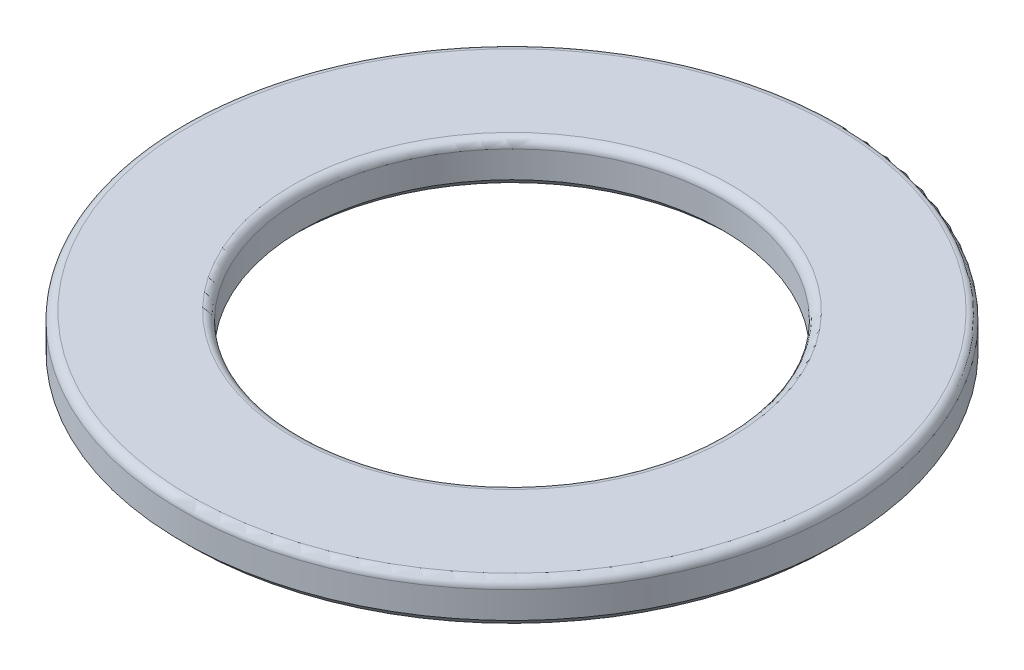
ISO-10303-21;
HEADER;
FILE_DESCRIPTION(('STEP AP214'),'2;1');
FILE_NAME('part.step','',(''),(''),'','','');
FILE_SCHEMA(('AUTOMOTIVE_DESIGN { 1 0 10303 214 1 1 1 1 }'));
ENDSEC;
DATA;
#1=APPLICATION_CONTEXT('core data for automotive mechanical design processes');
#2=APPLICATION_PROTOCOL_DEFINITION('international standard','automotive_design',2000,#1);
#3=PRODUCT_CONTEXT('',#1,'mechanical');
#4=PRODUCT('Part','Part','',(#3));
#5=PRODUCT_RELATED_PRODUCT_CATEGORY('part','',(#4));
#6=PRODUCT_DEFINITION_FORMATION('','',#4);
#7=PRODUCT_DEFINITION_CONTEXT('part definition',#1,'design');
#8=PRODUCT_DEFINITION('design','',#6,#7);
#9=PRODUCT_DEFINITION_SHAPE('','',#8);
#10=(LENGTH_UNIT() NAMED_UNIT(*) SI_UNIT(.MILLI.,.METRE.));
#11=(NAMED_UNIT(*) PLANE_ANGLE_UNIT() SI_UNIT($,.RADIAN.));
#12=(NAMED_UNIT(*) SI_UNIT($,.STERADIAN.) SOLID_ANGLE_UNIT());
#13=UNCERTAINTY_MEASURE_WITH_UNIT(LENGTH_MEASURE(1.E-05),#10,'distance_accuracy_value','');
#14=(GEOMETRIC_REPRESENTATION_CONTEXT(3) GLOBAL_UNCERTAINTY_ASSIGNED_CONTEXT((#13)) GLOBAL_UNIT_ASSIGNED_CONTEXT((#10,
#11,#12)) REPRESENTATION_CONTEXT('',''));
#15=CARTESIAN_POINT('',(0.,0.,0.));
#16=DIRECTION('',(0.,0.,1.));
#17=DIRECTION('',(1.,0.,0.));
#18=AXIS2_PLACEMENT_3D('',#15,#16,#17);
#19=CARTESIAN_POINT('',(19.25,11.,0.));
#20=DIRECTION('',(0.,1.,0.));
#21=DIRECTION('',(-1.,0.,0.));
#22=AXIS2_PLACEMENT_3D('',#19,#20,#21);
#23=PLANE('',#22);
#24=CARTESIAN_POINT('',(0.,11.,0.));
#25=DIRECTION('',(0.,-1.,0.));
#26=DIRECTION('',(1.,0.,0.));
#27=AXIS2_PLACEMENT_3D('',#24,#25,#26);
#28=CIRCLE('',#27,15.6);
#29=CARTESIAN_POINT('',(15.6,11.,0.));
#30=VERTEX_POINT('',#29);
#31=EDGE_CURVE('E11',#30,#30,#28,.T.);
#32=ORIENTED_EDGE('',*,*,#31,.T.);
#33=EDGE_LOOP('',(#32));
#34=FACE_BOUND('',#33,.T.);
#35=CARTESIAN_POINT('',(0.,11.,0.));
#36=DIRECTION('',(0.,-1.,0.));
#37=DIRECTION('',(1.,0.,0.));
#38=AXIS2_PLACEMENT_3D('',#35,#36,#37);
#39=CIRCLE('',#38,22.9);
#40=CARTESIAN_POINT('',(22.9,11.,0.));
#41=VERTEX_POINT('',#40);
#42=EDGE_CURVE('E65',#41,#41,#39,.T.);
#43=ORIENTED_EDGE('',*,*,#42,.F.);
#44=EDGE_LOOP('',(#43));
#45=FACE_BOUND('',#44,.T.);
#46=ADVANCED_FACE('F16',(#34,#45),#23,.T.);
#47=CARTESIAN_POINT('',(0.,10.4,0.));
#48=DIRECTION('',(0.,-1.,0.));
#49=DIRECTION('',(0.,0.,-1.));
#50=AXIS2_PLACEMENT_3D('',#47,#48,#49);
#51=TOROIDAL_SURFACE('',#50,15.6,0.6);
#52=CARTESIAN_POINT('',(0.,10.4,0.));
#53=DIRECTION('',(0.,-1.,0.));
#54=DIRECTION('',(1.,0.,0.));
#55=AXIS2_PLACEMENT_3D('',#52,#53,#54);
#56=CIRCLE('',#55,15.);
#57=CARTESIAN_POINT('',(15.,10.4,0.));
#58=VERTEX_POINT('',#57);
#59=EDGE_CURVE('E26',#58,#58,#56,.T.);
#60=ORIENTED_EDGE('',*,*,#59,.T.);
#61=EDGE_LOOP('',(#60));
#62=FACE_BOUND('',#61,.T.);
#63=ORIENTED_EDGE('',*,*,#31,.F.);
#64=EDGE_LOOP('',(#63));
#65=FACE_BOUND('',#64,.T.);
#66=ADVANCED_FACE('F18',(#62,#65),#51,.T.);
#67=CARTESIAN_POINT('',(0.,9.45,0.));
#68=DIRECTION('',(0.,1.,0.));
#69=DIRECTION('',(1.,0.,0.));
#70=AXIS2_PLACEMENT_3D('',#67,#68,#69);
#71=CYLINDRICAL_SURFACE('',#70,15.);
#72=CARTESIAN_POINT('',(0.,8.5,0.));
#73=DIRECTION('',(0.,-1.,0.));
#74=DIRECTION('',(1.,0.,0.));
#75=AXIS2_PLACEMENT_3D('',#72,#73,#74);
#76=CIRCLE('',#75,15.);
#77=CARTESIAN_POINT('',(15.,8.5,0.));
#78=VERTEX_POINT('',#77);
#79=EDGE_CURVE('E20',#78,#78,#76,.T.);
#80=ORIENTED_EDGE('',*,*,#79,.T.);
#81=EDGE_LOOP('',(#80));
#82=FACE_BOUND('',#81,.T.);
#83=ORIENTED_EDGE('',*,*,#59,.F.);
#84=EDGE_LOOP('',(#83));
#85=FACE_BOUND('',#84,.T.);
#86=ADVANCED_FACE('F82',(#82,#85),#71,.F.);
#87=CARTESIAN_POINT('',(0.,8.2,0.));
#88=DIRECTION('',(0.,-1.,0.));
#89=DIRECTION('',(1.,0.,0.));
#90=AXIS2_PLACEMENT_3D('',#87,#88,#89);
#91=CONICAL_SURFACE('',#90,15.3,0.785398163397448);
#92=CARTESIAN_POINT('',(0.,7.9,0.));
#93=DIRECTION('',(0.,-1.,0.));
#94=DIRECTION('',(1.,0.,0.));
#95=AXIS2_PLACEMENT_3D('',#92,#93,#94);
#96=CIRCLE('',#95,15.6);
#97=CARTESIAN_POINT('',(15.6,7.9,0.));
#98=VERTEX_POINT('',#97);
#99=EDGE_CURVE('E77',#98,#98,#96,.T.);
#100=ORIENTED_EDGE('',*,*,#99,.T.);
#101=EDGE_LOOP('',(#100));
#102=FACE_BOUND('',#101,.T.);
#103=ORIENTED_EDGE('',*,*,#79,.F.);
#104=EDGE_LOOP('',(#103));
#105=FACE_BOUND('',#104,.T.);
#106=ADVANCED_FACE('F85',(#102,#105),#91,.F.);
#107=CARTESIAN_POINT('',(16.525,7.9,0.));
#108=DIRECTION('',(0.,-1.,0.));
#109=DIRECTION('',(1.,0.,0.));
#110=AXIS2_PLACEMENT_3D('',#107,#108,#109);
#111=PLANE('',#110);
#112=CARTESIAN_POINT('',(0.,7.9,0.));
#113=DIRECTION('',(0.,-1.,0.));
#114=DIRECTION('',(1.,0.,0.));
#115=AXIS2_PLACEMENT_3D('',#112,#113,#114);
#116=CIRCLE('',#115,17.45);
#117=CARTESIAN_POINT('',(17.45,7.9,0.));
#118=VERTEX_POINT('',#117);
#119=EDGE_CURVE('E63',#118,#118,#116,.T.);
#120=ORIENTED_EDGE('',*,*,#119,.T.);
#121=EDGE_LOOP('',(#120));
#122=FACE_BOUND('',#121,.T.);
#123=ORIENTED_EDGE('',*,*,#99,.F.);
#124=EDGE_LOOP('',(#123));
#125=FACE_BOUND('',#124,.T.);
#126=ADVANCED_FACE('F87',(#122,#125),#111,.T.);
#127=CARTESIAN_POINT('',(0.,5.5,0.));
#128=DIRECTION('',(0.,-1.,0.));
#129=DIRECTION('',(0.,0.,-1.));
#130=AXIS2_PLACEMENT_3D('',#127,#128,#129);
#131=TOROIDAL_SURFACE('',#130,19.25,3.);
#132=CARTESIAN_POINT('',(0.,7.9,0.));
#133=DIRECTION('',(0.,-1.,0.));
#134=DIRECTION('',(1.,0.,0.));
#135=AXIS2_PLACEMENT_3D('',#132,#133,#134);
#136=CIRCLE('',#135,21.05);
#137=CARTESIAN_POINT('',(21.05,7.9,0.));
#138=VERTEX_POINT('',#137);
#139=EDGE_CURVE('E60',#138,#138,#136,.T.);
#140=ORIENTED_EDGE('',*,*,#139,.T.);
#141=EDGE_LOOP('',(#140));
#142=FACE_BOUND('',#141,.T.);
#143=ORIENTED_EDGE('',*,*,#119,.F.);
#144=EDGE_LOOP('',(#143));
#145=FACE_BOUND('',#144,.T.);
#146=ADVANCED_FACE('F94',(#142,#145),#131,.F.);
#147=CARTESIAN_POINT('',(21.975,7.9,0.));
#148=DIRECTION('',(0.,-1.,0.));
#149=DIRECTION('',(1.,0.,0.));
#150=AXIS2_PLACEMENT_3D('',#147,#148,#149);
#151=PLANE('',#150);
#152=CARTESIAN_POINT('',(0.,7.9,0.));
#153=DIRECTION('',(0.,-1.,0.));
#154=DIRECTION('',(1.,0.,0.));
#155=AXIS2_PLACEMENT_3D('',#152,#153,#154);
#156=CIRCLE('',#155,22.9);
#157=CARTESIAN_POINT('',(22.9,7.9,0.));
#158=VERTEX_POINT('',#157);
#159=EDGE_CURVE('E56',#158,#158,#156,.T.);
#160=ORIENTED_EDGE('',*,*,#159,.T.);
#161=EDGE_LOOP('',(#160));
#162=FACE_BOUND('',#161,.T.);
#163=ORIENTED_EDGE('',*,*,#139,.F.);
#164=EDGE_LOOP('',(#163));
#165=FACE_BOUND('',#164,.T.);
#166=ADVANCED_FACE('F57',(#162,#165),#151,.T.);
#167=CARTESIAN_POINT('',(0.,8.2,0.));
#168=DIRECTION('',(0.,1.,0.));
#169=DIRECTION('',(1.,0.,0.));
#170=AXIS2_PLACEMENT_3D('',#167,#168,#169);
#171=CONICAL_SURFACE('',#170,23.2,0.785398163397449);
#172=CARTESIAN_POINT('',(0.,8.5,0.));
#173=DIRECTION('',(0.,-1.,0.));
#174=DIRECTION('',(1.,0.,0.));
#175=AXIS2_PLACEMENT_3D('',#172,#173,#174);
#176=CIRCLE('',#175,23.5);
#177=CARTESIAN_POINT('',(23.5,8.5,0.));
#178=VERTEX_POINT('',#177);
#179=EDGE_CURVE('E61',#178,#178,#176,.T.);
#180=ORIENTED_EDGE('',*,*,#179,.T.);
#181=EDGE_LOOP('',(#180));
#182=FACE_BOUND('',#181,.T.);
#183=ORIENTED_EDGE('',*,*,#159,.F.);
#184=EDGE_LOOP('',(#183));
#185=FACE_BOUND('',#184,.T.);
#186=ADVANCED_FACE('F110',(#182,#185),#171,.T.);
#187=CARTESIAN_POINT('',(0.,9.45,0.));
#188=DIRECTION('',(0.,1.,0.));
#189=DIRECTION('',(1.,0.,0.));
#190=AXIS2_PLACEMENT_3D('',#187,#188,#189);
#191=CYLINDRICAL_SURFACE('',#190,23.5);
#192=CARTESIAN_POINT('',(0.,10.4,0.));
#193=DIRECTION('',(0.,-1.,0.));
#194=DIRECTION('',(1.,0.,0.));
#195=AXIS2_PLACEMENT_3D('',#192,#193,#194);
#196=CIRCLE('',#195,23.5);
#197=CARTESIAN_POINT('',(23.5,10.4,0.));
#198=VERTEX_POINT('',#197);
#199=EDGE_CURVE('E68',#198,#198,#196,.T.);
#200=ORIENTED_EDGE('',*,*,#199,.T.);
#201=EDGE_LOOP('',(#200));
#202=FACE_BOUND('',#201,.T.);
#203=ORIENTED_EDGE('',*,*,#179,.F.);
#204=EDGE_LOOP('',(#203));
#205=FACE_BOUND('',#204,.T.);
#206=ADVANCED_FACE('F115',(#202,#205),#191,.T.);
#207=CARTESIAN_POINT('',(0.,10.4,0.));
#208=DIRECTION('',(0.,-1.,0.));
#209=DIRECTION('',(0.,0.,-1.));
#210=AXIS2_PLACEMENT_3D('',#207,#208,#209);
#211=TOROIDAL_SURFACE('',#210,22.9,0.6);
#212=ORIENTED_EDGE('',*,*,#42,.T.);
#213=EDGE_LOOP('',(#212));
#214=FACE_BOUND('',#213,.T.);
#215=ORIENTED_EDGE('',*,*,#199,.F.);
#216=EDGE_LOOP('',(#215));
#217=FACE_BOUND('',#216,.T.);
#218=ADVANCED_FACE('F107',(#214,#217),#211,.T.);
#219=CLOSED_SHELL('',(#46,#66,#86,#106,#126,#146,#166,#186,#206,#218));
#220=MANIFOLD_SOLID_BREP('B1',#219);
#221=ADVANCED_BREP_SHAPE_REPRESENTATION('',(#18,#220),#14);
#222=SHAPE_DEFINITION_REPRESENTATION(#9,#221);
ENDSEC;
END-ISO-10303-21;
